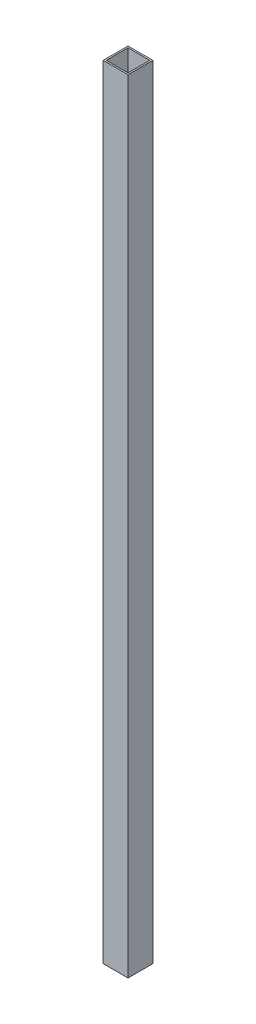
ISO-10303-21;
HEADER;
FILE_DESCRIPTION(('STEP AP214'),'2;1');
FILE_NAME('part.step','',(''),(''),'','','');
FILE_SCHEMA(('AUTOMOTIVE_DESIGN { 1 0 10303 214 1 1 1 1 }'));
ENDSEC;
DATA;
#1=APPLICATION_CONTEXT('core data for automotive mechanical design processes');
#2=APPLICATION_PROTOCOL_DEFINITION('international standard','automotive_design',2000,#1);
#3=PRODUCT_CONTEXT('',#1,'mechanical');
#4=PRODUCT('Part','Part','',(#3));
#5=PRODUCT_RELATED_PRODUCT_CATEGORY('part','',(#4));
#6=PRODUCT_DEFINITION_FORMATION('','',#4);
#7=PRODUCT_DEFINITION_CONTEXT('part definition',#1,'design');
#8=PRODUCT_DEFINITION('design','',#6,#7);
#9=PRODUCT_DEFINITION_SHAPE('','',#8);
#10=(LENGTH_UNIT() NAMED_UNIT(*) SI_UNIT(.MILLI.,.METRE.));
#11=(NAMED_UNIT(*) PLANE_ANGLE_UNIT() SI_UNIT($,.RADIAN.));
#12=(NAMED_UNIT(*) SI_UNIT($,.STERADIAN.) SOLID_ANGLE_UNIT());
#13=UNCERTAINTY_MEASURE_WITH_UNIT(LENGTH_MEASURE(1.E-05),#10,'distance_accuracy_value','');
#14=(GEOMETRIC_REPRESENTATION_CONTEXT(3) GLOBAL_UNCERTAINTY_ASSIGNED_CONTEXT((#13)) GLOBAL_UNIT_ASSIGNED_CONTEXT((#10,
#11,#12)) REPRESENTATION_CONTEXT('',''));
#15=CARTESIAN_POINT('',(0.,0.,0.));
#16=DIRECTION('',(0.,0.,1.));
#17=DIRECTION('',(1.,0.,0.));
#18=AXIS2_PLACEMENT_3D('',#15,#16,#17);
#19=CARTESIAN_POINT('',(0.,800.1,0.));
#20=DIRECTION('',(0.,1.,0.));
#21=DIRECTION('',(0.,0.,1.));
#22=AXIS2_PLACEMENT_3D('',#19,#20,#21);
#23=PLANE('',#22);
#24=DIRECTION('',(0.,0.,1.));
#25=VECTOR('',#24,1.);
#26=CARTESIAN_POINT('',(-12.7,800.1,12.7));
#27=LINE('',#26,#25);
#28=CARTESIAN_POINT('',(-12.7,800.1,-12.7));
#29=VERTEX_POINT('',#28);
#30=CARTESIAN_POINT('',(-12.7,800.1,12.7));
#31=VERTEX_POINT('',#30);
#32=EDGE_CURVE('E134',#29,#31,#27,.T.);
#33=ORIENTED_EDGE('',*,*,#32,.T.);
#34=DIRECTION('',(1.,0.,0.));
#35=VECTOR('',#34,1.);
#36=CARTESIAN_POINT('',(12.7,800.1,12.7));
#37=LINE('',#36,#35);
#38=CARTESIAN_POINT('',(12.7,800.1,12.7));
#39=VERTEX_POINT('',#38);
#40=EDGE_CURVE('E137',#31,#39,#37,.T.);
#41=ORIENTED_EDGE('',*,*,#40,.T.);
#42=DIRECTION('',(0.,0.,-1.));
#43=VECTOR('',#42,1.);
#44=CARTESIAN_POINT('',(12.7,800.1,12.7));
#45=LINE('',#44,#43);
#46=CARTESIAN_POINT('',(12.7,800.1,-12.7));
#47=VERTEX_POINT('',#46);
#48=EDGE_CURVE('E140',#39,#47,#45,.T.);
#49=ORIENTED_EDGE('',*,*,#48,.T.);
#50=DIRECTION('',(-1.,0.,0.));
#51=VECTOR('',#50,1.);
#52=CARTESIAN_POINT('',(12.7,800.1,-12.7));
#53=LINE('',#52,#51);
#54=EDGE_CURVE('E142',#47,#29,#53,.T.);
#55=ORIENTED_EDGE('',*,*,#54,.T.);
#56=EDGE_LOOP('',(#33,#41,#49,#55));
#57=FACE_BOUND('',#56,.T.);
#58=DIRECTION('',(1.,0.,0.));
#59=VECTOR('',#58,1.);
#60=CARTESIAN_POINT('',(11.1125,800.1,11.1125));
#61=LINE('',#60,#59);
#62=CARTESIAN_POINT('',(-11.1125,800.1,11.1125));
#63=VERTEX_POINT('',#62);
#64=CARTESIAN_POINT('',(11.1125,800.1,11.1125));
#65=VERTEX_POINT('',#64);
#66=EDGE_CURVE('E106',#63,#65,#61,.T.);
#67=ORIENTED_EDGE('',*,*,#66,.F.);
#68=DIRECTION('',(0.,0.,1.));
#69=VECTOR('',#68,1.);
#70=CARTESIAN_POINT('',(-11.1125,800.1,11.1125));
#71=LINE('',#70,#69);
#72=CARTESIAN_POINT('',(-11.1125,800.1,-11.1125));
#73=VERTEX_POINT('',#72);
#74=EDGE_CURVE('E98',#73,#63,#71,.T.);
#75=ORIENTED_EDGE('',*,*,#74,.F.);
#76=DIRECTION('',(-1.,0.,0.));
#77=VECTOR('',#76,1.);
#78=CARTESIAN_POINT('',(11.1125,800.1,-11.1125));
#79=LINE('',#78,#77);
#80=CARTESIAN_POINT('',(11.1125,800.1,-11.1125));
#81=VERTEX_POINT('',#80);
#82=EDGE_CURVE('E120',#81,#73,#79,.T.);
#83=ORIENTED_EDGE('',*,*,#82,.F.);
#84=DIRECTION('',(0.,0.,-1.));
#85=VECTOR('',#84,1.);
#86=CARTESIAN_POINT('',(11.1125,800.1,11.1125));
#87=LINE('',#86,#85);
#88=EDGE_CURVE('E118',#65,#81,#87,.T.);
#89=ORIENTED_EDGE('',*,*,#88,.F.);
#90=EDGE_LOOP('',(#67,#75,#83,#89));
#91=FACE_BOUND('',#90,.T.);
#92=ADVANCED_FACE('F33',(#57,#91),#23,.T.);
#93=CARTESIAN_POINT('',(0.,0.,0.));
#94=DIRECTION('',(0.,1.,0.));
#95=DIRECTION('',(0.,0.,1.));
#96=AXIS2_PLACEMENT_3D('',#93,#94,#95);
#97=PLANE('',#96);
#98=DIRECTION('',(0.,0.,1.));
#99=VECTOR('',#98,1.);
#100=CARTESIAN_POINT('',(-12.7,0.,12.7));
#101=LINE('',#100,#99);
#102=CARTESIAN_POINT('',(-12.7,0.,-12.7));
#103=VERTEX_POINT('',#102);
#104=CARTESIAN_POINT('',(-12.7,0.,12.7));
#105=VERTEX_POINT('',#104);
#106=EDGE_CURVE('E114',#103,#105,#101,.T.);
#107=ORIENTED_EDGE('',*,*,#106,.F.);
#108=DIRECTION('',(-1.,0.,0.));
#109=VECTOR('',#108,1.);
#110=CARTESIAN_POINT('',(12.7,0.,-12.7));
#111=LINE('',#110,#109);
#112=CARTESIAN_POINT('',(12.7,0.,-12.7));
#113=VERTEX_POINT('',#112);
#114=EDGE_CURVE('E138',#113,#103,#111,.T.);
#115=ORIENTED_EDGE('',*,*,#114,.F.);
#116=DIRECTION('',(0.,0.,-1.));
#117=VECTOR('',#116,1.);
#118=CARTESIAN_POINT('',(12.7,0.,12.7));
#119=LINE('',#118,#117);
#120=CARTESIAN_POINT('',(12.7,0.,12.7));
#121=VERTEX_POINT('',#120);
#122=EDGE_CURVE('E149',#121,#113,#119,.T.);
#123=ORIENTED_EDGE('',*,*,#122,.F.);
#124=DIRECTION('',(1.,0.,0.));
#125=VECTOR('',#124,1.);
#126=CARTESIAN_POINT('',(12.7,0.,12.7));
#127=LINE('',#126,#125);
#128=EDGE_CURVE('E147',#105,#121,#127,.T.);
#129=ORIENTED_EDGE('',*,*,#128,.F.);
#130=EDGE_LOOP('',(#107,#115,#123,#129));
#131=FACE_BOUND('',#130,.T.);
#132=DIRECTION('',(0.,0.,1.));
#133=VECTOR('',#132,1.);
#134=CARTESIAN_POINT('',(-11.1125,0.,11.1125));
#135=LINE('',#134,#133);
#136=CARTESIAN_POINT('',(-11.1125,0.,-11.1125));
#137=VERTEX_POINT('',#136);
#138=CARTESIAN_POINT('',(-11.1125,0.,11.1125));
#139=VERTEX_POINT('',#138);
#140=EDGE_CURVE('E56',#137,#139,#135,.T.);
#141=ORIENTED_EDGE('',*,*,#140,.T.);
#142=DIRECTION('',(1.,0.,0.));
#143=VECTOR('',#142,1.);
#144=CARTESIAN_POINT('',(11.1125,0.,11.1125));
#145=LINE('',#144,#143);
#146=CARTESIAN_POINT('',(11.1125,0.,11.1125));
#147=VERTEX_POINT('',#146);
#148=EDGE_CURVE('E113',#139,#147,#145,.T.);
#149=ORIENTED_EDGE('',*,*,#148,.T.);
#150=DIRECTION('',(0.,0.,-1.));
#151=VECTOR('',#150,1.);
#152=CARTESIAN_POINT('',(11.1125,0.,11.1125));
#153=LINE('',#152,#151);
#154=CARTESIAN_POINT('',(11.1125,0.,-11.1125));
#155=VERTEX_POINT('',#154);
#156=EDGE_CURVE('E126',#147,#155,#153,.T.);
#157=ORIENTED_EDGE('',*,*,#156,.T.);
#158=DIRECTION('',(-1.,0.,0.));
#159=VECTOR('',#158,1.);
#160=CARTESIAN_POINT('',(11.1125,0.,-11.1125));
#161=LINE('',#160,#159);
#162=EDGE_CURVE('E107',#155,#137,#161,.T.);
#163=ORIENTED_EDGE('',*,*,#162,.T.);
#164=EDGE_LOOP('',(#141,#149,#157,#163));
#165=FACE_BOUND('',#164,.T.);
#166=ADVANCED_FACE('F167',(#131,#165),#97,.F.);
#167=CARTESIAN_POINT('',(-12.7,800.1,12.7));
#168=DIRECTION('',(1.,0.,0.));
#169=DIRECTION('',(0.,0.,-1.));
#170=AXIS2_PLACEMENT_3D('',#167,#168,#169);
#171=PLANE('',#170);
#172=ORIENTED_EDGE('',*,*,#106,.T.);
#173=DIRECTION('',(0.,-1.,0.));
#174=VECTOR('',#173,1.);
#175=CARTESIAN_POINT('',(-12.7,800.1,12.7));
#176=LINE('',#175,#174);
#177=EDGE_CURVE('E11',#31,#105,#176,.T.);
#178=ORIENTED_EDGE('',*,*,#177,.F.);
#179=ORIENTED_EDGE('',*,*,#32,.F.);
#180=DIRECTION('',(0.,-1.,0.));
#181=VECTOR('',#180,1.);
#182=CARTESIAN_POINT('',(-12.7,800.1,-12.7));
#183=LINE('',#182,#181);
#184=EDGE_CURVE('E144',#29,#103,#183,.T.);
#185=ORIENTED_EDGE('',*,*,#184,.T.);
#186=EDGE_LOOP('',(#172,#178,#179,#185));
#187=FACE_BOUND('',#186,.T.);
#188=ADVANCED_FACE('F35',(#187),#171,.F.);
#189=CARTESIAN_POINT('',(12.7,800.1,12.7));
#190=DIRECTION('',(0.,0.,-1.));
#191=DIRECTION('',(-1.,0.,0.));
#192=AXIS2_PLACEMENT_3D('',#189,#190,#191);
#193=PLANE('',#192);
#194=ORIENTED_EDGE('',*,*,#128,.T.);
#195=DIRECTION('',(0.,-1.,0.));
#196=VECTOR('',#195,1.);
#197=CARTESIAN_POINT('',(12.7,800.1,12.7));
#198=LINE('',#197,#196);
#199=EDGE_CURVE('E41',#39,#121,#198,.T.);
#200=ORIENTED_EDGE('',*,*,#199,.F.);
#201=ORIENTED_EDGE('',*,*,#40,.F.);
#202=ORIENTED_EDGE('',*,*,#177,.T.);
#203=EDGE_LOOP('',(#194,#200,#201,#202));
#204=FACE_BOUND('',#203,.T.);
#205=ADVANCED_FACE('F177',(#204),#193,.F.);
#206=CARTESIAN_POINT('',(12.7,800.1,12.7));
#207=DIRECTION('',(-1.,0.,0.));
#208=DIRECTION('',(0.,0.,1.));
#209=AXIS2_PLACEMENT_3D('',#206,#207,#208);
#210=PLANE('',#209);
#211=ORIENTED_EDGE('',*,*,#122,.T.);
#212=DIRECTION('',(0.,-1.,0.));
#213=VECTOR('',#212,1.);
#214=CARTESIAN_POINT('',(12.7,800.1,-12.7));
#215=LINE('',#214,#213);
#216=EDGE_CURVE('E154',#47,#113,#215,.T.);
#217=ORIENTED_EDGE('',*,*,#216,.F.);
#218=ORIENTED_EDGE('',*,*,#48,.F.);
#219=ORIENTED_EDGE('',*,*,#199,.T.);
#220=EDGE_LOOP('',(#211,#217,#218,#219));
#221=FACE_BOUND('',#220,.T.);
#222=ADVANCED_FACE('F161',(#221),#210,.F.);
#223=CARTESIAN_POINT('',(12.7,800.1,-12.7));
#224=DIRECTION('',(0.,0.,1.));
#225=DIRECTION('',(1.,0.,0.));
#226=AXIS2_PLACEMENT_3D('',#223,#224,#225);
#227=PLANE('',#226);
#228=ORIENTED_EDGE('',*,*,#114,.T.);
#229=ORIENTED_EDGE('',*,*,#184,.F.);
#230=ORIENTED_EDGE('',*,*,#54,.F.);
#231=ORIENTED_EDGE('',*,*,#216,.T.);
#232=EDGE_LOOP('',(#228,#229,#230,#231));
#233=FACE_BOUND('',#232,.T.);
#234=ADVANCED_FACE('F171',(#233),#227,.F.);
#235=CARTESIAN_POINT('',(-11.1125,800.1,11.1125));
#236=DIRECTION('',(1.,0.,0.));
#237=DIRECTION('',(0.,0.,-1.));
#238=AXIS2_PLACEMENT_3D('',#235,#236,#237);
#239=PLANE('',#238);
#240=ORIENTED_EDGE('',*,*,#140,.F.);
#241=DIRECTION('',(0.,-1.,0.));
#242=VECTOR('',#241,1.);
#243=CARTESIAN_POINT('',(-11.1125,800.1,-11.1125));
#244=LINE('',#243,#242);
#245=EDGE_CURVE('E102',#73,#137,#244,.T.);
#246=ORIENTED_EDGE('',*,*,#245,.F.);
#247=ORIENTED_EDGE('',*,*,#74,.T.);
#248=DIRECTION('',(0.,-1.,0.));
#249=VECTOR('',#248,1.);
#250=CARTESIAN_POINT('',(-11.1125,800.1,11.1125));
#251=LINE('',#250,#249);
#252=EDGE_CURVE('E101',#63,#139,#251,.T.);
#253=ORIENTED_EDGE('',*,*,#252,.T.);
#254=EDGE_LOOP('',(#240,#246,#247,#253));
#255=FACE_BOUND('',#254,.T.);
#256=ADVANCED_FACE('F100',(#255),#239,.T.);
#257=CARTESIAN_POINT('',(11.1125,800.1,11.1125));
#258=DIRECTION('',(0.,0.,-1.));
#259=DIRECTION('',(-1.,0.,0.));
#260=AXIS2_PLACEMENT_3D('',#257,#258,#259);
#261=PLANE('',#260);
#262=ORIENTED_EDGE('',*,*,#148,.F.);
#263=ORIENTED_EDGE('',*,*,#252,.F.);
#264=ORIENTED_EDGE('',*,*,#66,.T.);
#265=DIRECTION('',(0.,-1.,0.));
#266=VECTOR('',#265,1.);
#267=CARTESIAN_POINT('',(11.1125,800.1,11.1125));
#268=LINE('',#267,#266);
#269=EDGE_CURVE('E115',#65,#147,#268,.T.);
#270=ORIENTED_EDGE('',*,*,#269,.T.);
#271=EDGE_LOOP('',(#262,#263,#264,#270));
#272=FACE_BOUND('',#271,.T.);
#273=ADVANCED_FACE('F110',(#272),#261,.T.);
#274=CARTESIAN_POINT('',(11.1125,800.1,11.1125));
#275=DIRECTION('',(-1.,0.,0.));
#276=DIRECTION('',(0.,0.,1.));
#277=AXIS2_PLACEMENT_3D('',#274,#275,#276);
#278=PLANE('',#277);
#279=ORIENTED_EDGE('',*,*,#156,.F.);
#280=ORIENTED_EDGE('',*,*,#269,.F.);
#281=ORIENTED_EDGE('',*,*,#88,.T.);
#282=DIRECTION('',(0.,-1.,0.));
#283=VECTOR('',#282,1.);
#284=CARTESIAN_POINT('',(11.1125,800.1,-11.1125));
#285=LINE('',#284,#283);
#286=EDGE_CURVE('E48',#81,#155,#285,.T.);
#287=ORIENTED_EDGE('',*,*,#286,.T.);
#288=EDGE_LOOP('',(#279,#280,#281,#287));
#289=FACE_BOUND('',#288,.T.);
#290=ADVANCED_FACE('F200',(#289),#278,.T.);
#291=CARTESIAN_POINT('',(11.1125,800.1,-11.1125));
#292=DIRECTION('',(0.,0.,1.));
#293=DIRECTION('',(1.,0.,0.));
#294=AXIS2_PLACEMENT_3D('',#291,#292,#293);
#295=PLANE('',#294);
#296=ORIENTED_EDGE('',*,*,#162,.F.);
#297=ORIENTED_EDGE('',*,*,#286,.F.);
#298=ORIENTED_EDGE('',*,*,#82,.T.);
#299=ORIENTED_EDGE('',*,*,#245,.T.);
#300=EDGE_LOOP('',(#296,#297,#298,#299));
#301=FACE_BOUND('',#300,.T.);
#302=ADVANCED_FACE('F204',(#301),#295,.T.);
#303=CLOSED_SHELL('',(#92,#166,#188,#205,#222,#234,#256,#273,#290,#302));
#304=MANIFOLD_SOLID_BREP('B2',#303);
#305=ADVANCED_BREP_SHAPE_REPRESENTATION('',(#18,#304),#14);
#306=SHAPE_DEFINITION_REPRESENTATION(#9,#305);
ENDSEC;
END-ISO-10303-21;
